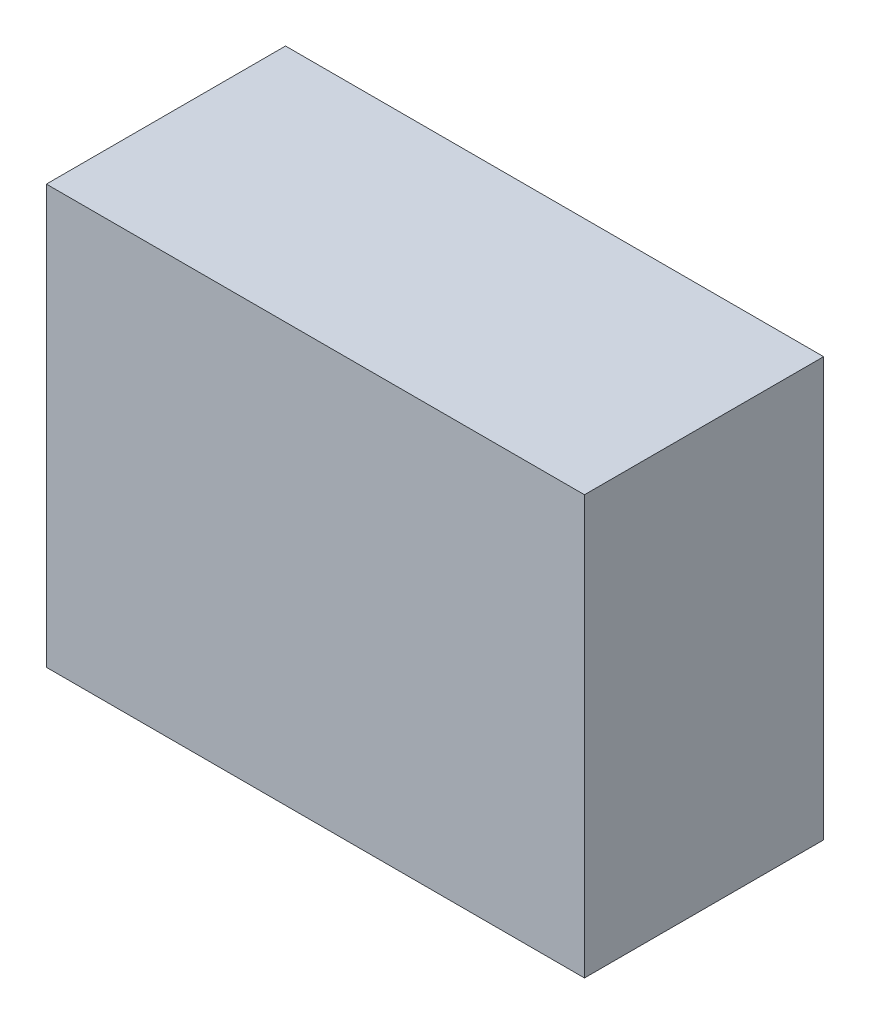
ISO-10303-21;
HEADER;
FILE_DESCRIPTION(('STEP AP214'),'2;1');
FILE_NAME('part.step','',(''),(''),'','','');
FILE_SCHEMA(('AUTOMOTIVE_DESIGN { 1 0 10303 214 1 1 1 1 }'));
ENDSEC;
DATA;
#1=APPLICATION_CONTEXT('core data for automotive mechanical design processes');
#2=APPLICATION_PROTOCOL_DEFINITION('international standard','automotive_design',2000,#1);
#3=PRODUCT_CONTEXT('',#1,'mechanical');
#4=PRODUCT('Part','Part','',(#3));
#5=PRODUCT_RELATED_PRODUCT_CATEGORY('part','',(#4));
#6=PRODUCT_DEFINITION_FORMATION('','',#4);
#7=PRODUCT_DEFINITION_CONTEXT('part definition',#1,'design');
#8=PRODUCT_DEFINITION('design','',#6,#7);
#9=PRODUCT_DEFINITION_SHAPE('','',#8);
#10=(LENGTH_UNIT() NAMED_UNIT(*) SI_UNIT(.MILLI.,.METRE.));
#11=(NAMED_UNIT(*) PLANE_ANGLE_UNIT() SI_UNIT($,.RADIAN.));
#12=(NAMED_UNIT(*) SI_UNIT($,.STERADIAN.) SOLID_ANGLE_UNIT());
#13=UNCERTAINTY_MEASURE_WITH_UNIT(LENGTH_MEASURE(1.E-05),#10,'distance_accuracy_value','');
#14=(GEOMETRIC_REPRESENTATION_CONTEXT(3) GLOBAL_UNCERTAINTY_ASSIGNED_CONTEXT((#13)) GLOBAL_UNIT_ASSIGNED_CONTEXT((#10,
#11,#12)) REPRESENTATION_CONTEXT('',''));
#15=CARTESIAN_POINT('',(0.,0.,0.));
#16=DIRECTION('',(0.,0.,1.));
#17=DIRECTION('',(1.,0.,0.));
#18=AXIS2_PLACEMENT_3D('',#15,#16,#17);
#19=CARTESIAN_POINT('',(-228.6,177.8,203.2));
#20=DIRECTION('',(1.,0.,0.));
#21=DIRECTION('',(0.,1.,0.));
#22=AXIS2_PLACEMENT_3D('',#19,#20,#21);
#23=PLANE('',#22);
#24=DIRECTION('',(0.,-1.,0.));
#25=VECTOR('',#24,1.);
#26=CARTESIAN_POINT('',(-228.6,177.8,0.));
#27=LINE('',#26,#25);
#28=CARTESIAN_POINT('',(-228.6,177.8,0.));
#29=VERTEX_POINT('',#28);
#30=CARTESIAN_POINT('',(-228.6,-177.8,0.));
#31=VERTEX_POINT('',#30);
#32=EDGE_CURVE('E117',#29,#31,#27,.T.);
#33=ORIENTED_EDGE('',*,*,#32,.T.);
#34=DIRECTION('',(0.,0.,-1.));
#35=VECTOR('',#34,1.);
#36=CARTESIAN_POINT('',(-228.6,-177.8,203.2));
#37=LINE('',#36,#35);
#38=CARTESIAN_POINT('',(-228.6,-177.8,203.2));
#39=VERTEX_POINT('',#38);
#40=EDGE_CURVE('E11',#39,#31,#37,.T.);
#41=ORIENTED_EDGE('',*,*,#40,.F.);
#42=DIRECTION('',(0.,-1.,0.));
#43=VECTOR('',#42,1.);
#44=CARTESIAN_POINT('',(-228.6,177.8,203.2));
#45=LINE('',#44,#43);
#46=CARTESIAN_POINT('',(-228.6,177.8,203.2));
#47=VERTEX_POINT('',#46);
#48=EDGE_CURVE('E101',#47,#39,#45,.T.);
#49=ORIENTED_EDGE('',*,*,#48,.F.);
#50=DIRECTION('',(0.,0.,-1.));
#51=VECTOR('',#50,1.);
#52=CARTESIAN_POINT('',(-228.6,177.8,203.2));
#53=LINE('',#52,#51);
#54=EDGE_CURVE('E113',#47,#29,#53,.T.);
#55=ORIENTED_EDGE('',*,*,#54,.T.);
#56=EDGE_LOOP('',(#33,#41,#49,#55));
#57=FACE_BOUND('',#56,.T.);
#58=ADVANCED_FACE('F49',(#57),#23,.F.);
#59=CARTESIAN_POINT('',(228.6,-177.8,203.2));
#60=DIRECTION('',(0.,1.,0.));
#61=DIRECTION('',(-1.,0.,0.));
#62=AXIS2_PLACEMENT_3D('',#59,#60,#61);
#63=PLANE('',#62);
#64=DIRECTION('',(1.,0.,0.));
#65=VECTOR('',#64,1.);
#66=CARTESIAN_POINT('',(228.6,-177.8,0.));
#67=LINE('',#66,#65);
#68=CARTESIAN_POINT('',(228.6,-177.8,0.));
#69=VERTEX_POINT('',#68);
#70=EDGE_CURVE('E106',#31,#69,#67,.T.);
#71=ORIENTED_EDGE('',*,*,#70,.T.);
#72=DIRECTION('',(0.,0.,-1.));
#73=VECTOR('',#72,1.);
#74=CARTESIAN_POINT('',(228.6,-177.8,203.2));
#75=LINE('',#74,#73);
#76=CARTESIAN_POINT('',(228.6,-177.8,203.2));
#77=VERTEX_POINT('',#76);
#78=EDGE_CURVE('E58',#77,#69,#75,.T.);
#79=ORIENTED_EDGE('',*,*,#78,.F.);
#80=DIRECTION('',(1.,0.,0.));
#81=VECTOR('',#80,1.);
#82=CARTESIAN_POINT('',(228.6,-177.8,203.2));
#83=LINE('',#82,#81);
#84=EDGE_CURVE('E96',#39,#77,#83,.T.);
#85=ORIENTED_EDGE('',*,*,#84,.F.);
#86=ORIENTED_EDGE('',*,*,#40,.T.);
#87=EDGE_LOOP('',(#71,#79,#85,#86));
#88=FACE_BOUND('',#87,.T.);
#89=ADVANCED_FACE('F105',(#88),#63,.F.);
#90=CARTESIAN_POINT('',(228.6,177.8,203.2));
#91=DIRECTION('',(-1.,0.,0.));
#92=DIRECTION('',(0.,-1.,0.));
#93=AXIS2_PLACEMENT_3D('',#90,#91,#92);
#94=PLANE('',#93);
#95=DIRECTION('',(0.,1.,0.));
#96=VECTOR('',#95,1.);
#97=CARTESIAN_POINT('',(228.6,177.8,0.));
#98=LINE('',#97,#96);
#99=CARTESIAN_POINT('',(228.6,177.8,0.));
#100=VERTEX_POINT('',#99);
#101=EDGE_CURVE('E83',#69,#100,#98,.T.);
#102=ORIENTED_EDGE('',*,*,#101,.T.);
#103=DIRECTION('',(0.,0.,-1.));
#104=VECTOR('',#103,1.);
#105=CARTESIAN_POINT('',(228.6,177.8,203.2));
#106=LINE('',#105,#104);
#107=CARTESIAN_POINT('',(228.6,177.8,203.2));
#108=VERTEX_POINT('',#107);
#109=EDGE_CURVE('E108',#108,#100,#106,.T.);
#110=ORIENTED_EDGE('',*,*,#109,.F.);
#111=DIRECTION('',(0.,1.,0.));
#112=VECTOR('',#111,1.);
#113=CARTESIAN_POINT('',(228.6,177.8,203.2));
#114=LINE('',#113,#112);
#115=EDGE_CURVE('E99',#77,#108,#114,.T.);
#116=ORIENTED_EDGE('',*,*,#115,.F.);
#117=ORIENTED_EDGE('',*,*,#78,.T.);
#118=EDGE_LOOP('',(#102,#110,#116,#117));
#119=FACE_BOUND('',#118,.T.);
#120=ADVANCED_FACE('F109',(#119),#94,.F.);
#121=CARTESIAN_POINT('',(228.6,177.8,203.2));
#122=DIRECTION('',(0.,-1.,0.));
#123=DIRECTION('',(1.,0.,0.));
#124=AXIS2_PLACEMENT_3D('',#121,#122,#123);
#125=PLANE('',#124);
#126=DIRECTION('',(-1.,0.,0.));
#127=VECTOR('',#126,1.);
#128=CARTESIAN_POINT('',(228.6,177.8,0.));
#129=LINE('',#128,#127);
#130=EDGE_CURVE('E89',#100,#29,#129,.T.);
#131=ORIENTED_EDGE('',*,*,#130,.T.);
#132=ORIENTED_EDGE('',*,*,#54,.F.);
#133=DIRECTION('',(-1.,0.,0.));
#134=VECTOR('',#133,1.);
#135=CARTESIAN_POINT('',(228.6,177.8,203.2));
#136=LINE('',#135,#134);
#137=EDGE_CURVE('E66',#108,#47,#136,.T.);
#138=ORIENTED_EDGE('',*,*,#137,.F.);
#139=ORIENTED_EDGE('',*,*,#109,.T.);
#140=EDGE_LOOP('',(#131,#132,#138,#139));
#141=FACE_BOUND('',#140,.T.);
#142=ADVANCED_FACE('F130',(#141),#125,.F.);
#143=CARTESIAN_POINT('',(0.,0.,203.2));
#144=DIRECTION('',(0.,0.,-1.));
#145=DIRECTION('',(-1.,0.,0.));
#146=AXIS2_PLACEMENT_3D('',#143,#144,#145);
#147=PLANE('',#146);
#148=ORIENTED_EDGE('',*,*,#48,.T.);
#149=ORIENTED_EDGE('',*,*,#84,.T.);
#150=ORIENTED_EDGE('',*,*,#115,.T.);
#151=ORIENTED_EDGE('',*,*,#137,.T.);
#152=EDGE_LOOP('',(#148,#149,#150,#151));
#153=FACE_BOUND('',#152,.T.);
#154=ADVANCED_FACE('F97',(#153),#147,.F.);
#155=CARTESIAN_POINT('',(0.,0.,0.));
#156=DIRECTION('',(0.,0.,-1.));
#157=DIRECTION('',(-1.,0.,0.));
#158=AXIS2_PLACEMENT_3D('',#155,#156,#157);
#159=PLANE('',#158);
#160=ORIENTED_EDGE('',*,*,#32,.F.);
#161=ORIENTED_EDGE('',*,*,#130,.F.);
#162=ORIENTED_EDGE('',*,*,#101,.F.);
#163=ORIENTED_EDGE('',*,*,#70,.F.);
#164=EDGE_LOOP('',(#160,#161,#162,#163));
#165=FACE_BOUND('',#164,.T.);
#166=ADVANCED_FACE('F133',(#165),#159,.T.);
#167=CLOSED_SHELL('',(#58,#89,#120,#142,#154,#166));
#168=MANIFOLD_SOLID_BREP('B2',#167);
#169=ADVANCED_BREP_SHAPE_REPRESENTATION('',(#18,#168),#14);
#170=SHAPE_DEFINITION_REPRESENTATION(#9,#169);
ENDSEC;
END-ISO-10303-21;
